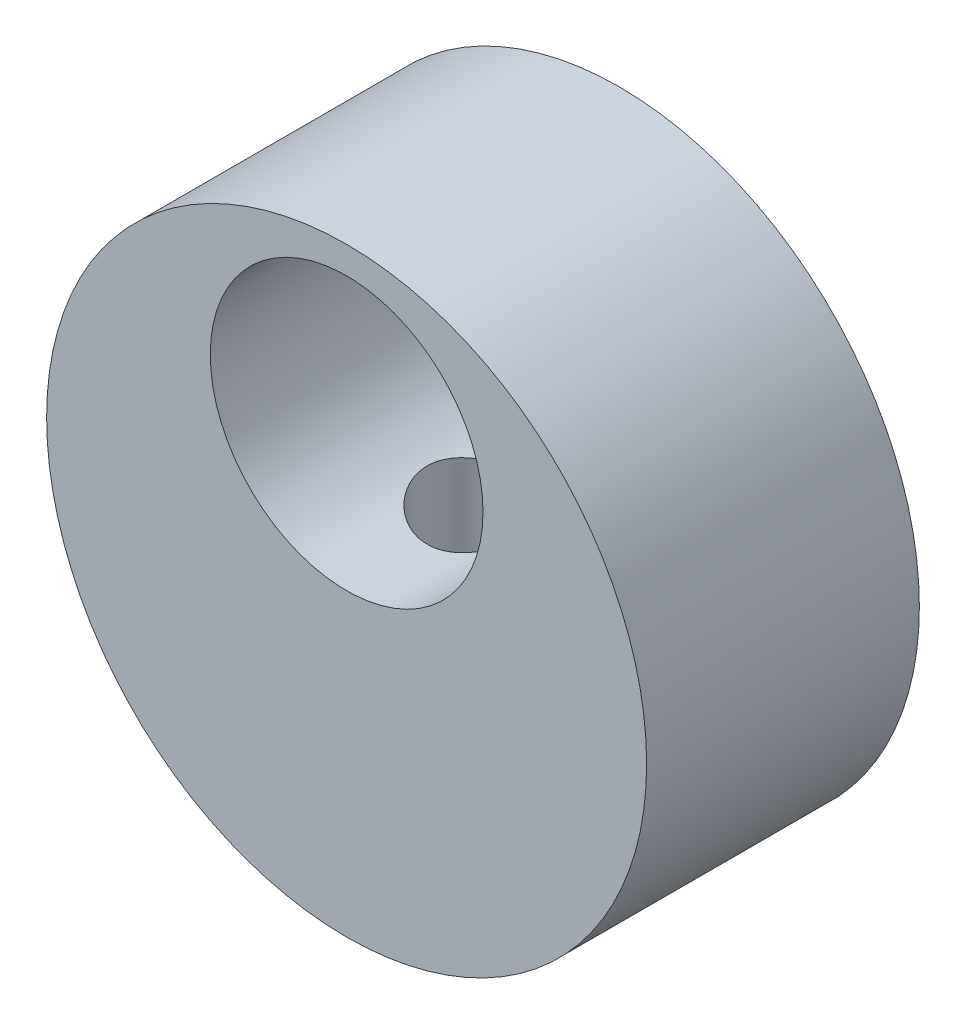
ISO-10303-21;
HEADER;
FILE_DESCRIPTION(('STEP AP214'),'2;1');
FILE_NAME('part.step','',(''),(''),'','','');
FILE_SCHEMA(('AUTOMOTIVE_DESIGN { 1 0 10303 214 1 1 1 1 }'));
ENDSEC;
DATA;
#1=APPLICATION_CONTEXT('core data for automotive mechanical design processes');
#2=APPLICATION_PROTOCOL_DEFINITION('international standard','automotive_design',2000,#1);
#3=PRODUCT_CONTEXT('',#1,'mechanical');
#4=PRODUCT('Part','Part','',(#3));
#5=PRODUCT_RELATED_PRODUCT_CATEGORY('part','',(#4));
#6=PRODUCT_DEFINITION_FORMATION('','',#4);
#7=PRODUCT_DEFINITION_CONTEXT('part definition',#1,'design');
#8=PRODUCT_DEFINITION('design','',#6,#7);
#9=PRODUCT_DEFINITION_SHAPE('','',#8);
#10=(LENGTH_UNIT() NAMED_UNIT(*) SI_UNIT(.MILLI.,.METRE.));
#11=(NAMED_UNIT(*) PLANE_ANGLE_UNIT() SI_UNIT($,.RADIAN.));
#12=(NAMED_UNIT(*) SI_UNIT($,.STERADIAN.) SOLID_ANGLE_UNIT());
#13=UNCERTAINTY_MEASURE_WITH_UNIT(LENGTH_MEASURE(1.E-05),#10,'distance_accuracy_value','');
#14=(GEOMETRIC_REPRESENTATION_CONTEXT(3) GLOBAL_UNCERTAINTY_ASSIGNED_CONTEXT((#13)) GLOBAL_UNIT_ASSIGNED_CONTEXT((#10,
#11,#12)) REPRESENTATION_CONTEXT('',''));
#15=CARTESIAN_POINT('',(0.,0.,0.));
#16=DIRECTION('',(0.,0.,1.));
#17=DIRECTION('',(1.,0.,0.));
#18=AXIS2_PLACEMENT_3D('',#15,#16,#17);
#19=CARTESIAN_POINT('',(0.,0.,5.));
#20=DIRECTION('',(0.,0.,-1.));
#21=DIRECTION('',(-1.,0.,0.));
#22=AXIS2_PLACEMENT_3D('',#19,#20,#21);
#23=CYLINDRICAL_SURFACE('',#22,5.5);
#24=CARTESIAN_POINT('',(0.,-5.5,1.47500000000001));
#25=CARTESIAN_POINT('',(-0.0570454154887206,-5.49999896917918,1.47500218651317));
#26=CARTESIAN_POINT('',(-0.114119352530093,-5.4991033284911,1.47977830587974));
#27=CARTESIAN_POINT('',(-0.226659349740724,-5.49561676296069,1.49874454029604));
#28=CARTESIAN_POINT('',(-0.282124004231445,-5.49302440001204,1.51294264136262));
#29=CARTESIAN_POINT('',(-0.38980155033272,-5.48643442315173,1.55030335954706));
#30=CARTESIAN_POINT('',(-0.442017314090575,-5.48243807181068,1.57345792423163));
#31=CARTESIAN_POINT('',(-0.54181793199329,-5.47347668726221,1.62805153966924));
#32=CARTESIAN_POINT('',(-0.589403169341833,-5.46851173431471,1.65948990408869));
#33=CARTESIAN_POINT('',(-0.679160163843666,-5.45809557817604,1.73015379118843));
#34=CARTESIAN_POINT('',(-0.721269178927114,-5.45263977785274,1.7694583391934));
#35=CARTESIAN_POINT('',(-0.79833567430584,-5.44189101023455,1.85456888125269));
#36=CARTESIAN_POINT('',(-0.83329264461948,-5.43659805457425,1.9003753385361));
#37=CARTESIAN_POINT('',(-0.895323167811041,-5.42672958887379,1.99763211789463));
#38=CARTESIAN_POINT('',(-0.922332998431911,-5.42216000688211,2.04912373654006));
#39=CARTESIAN_POINT('',(-0.967294632785072,-5.41432039127752,2.15601312085753));
#40=CARTESIAN_POINT('',(-0.985247207794641,-5.41105024701508,2.21141055346906));
#41=CARTESIAN_POINT('',(-1.0113835712208,-5.4062260050996,2.32386805251153));
#42=CARTESIAN_POINT('',(-1.01967671723467,-5.40465271223271,2.38090186331639));
#43=CARTESIAN_POINT('',(-1.02659822899771,-5.40334242353479,2.49557144109255));
#44=CARTESIAN_POINT('',(-1.02522745085078,-5.40360526504501,2.55320715429109));
#45=CARTESIAN_POINT('',(-1.01294872355646,-5.40592006826577,2.66665285649531));
#46=CARTESIAN_POINT('',(-1.00216504021043,-5.407948717441,2.72247684121865));
#47=CARTESIAN_POINT('',(-0.971562272403574,-5.4135299477407,2.83150916535301));
#48=CARTESIAN_POINT('',(-0.951742808207182,-5.41708259291189,2.88471739473079));
#49=CARTESIAN_POINT('',(-0.903509298071749,-5.42533593832795,2.98737189988671));
#50=CARTESIAN_POINT('',(-0.875044993688807,-5.43004332022502,3.03679400172326));
#51=CARTESIAN_POINT('',(-0.810365352558061,-5.4400713050207,3.13020726858463));
#52=CARTESIAN_POINT('',(-0.774149238363427,-5.4453919694021,3.1741978881753));
#53=CARTESIAN_POINT('',(-0.694323627738361,-5.45614864245733,3.25621750980742));
#54=CARTESIAN_POINT('',(-0.650607823669088,-5.46158515740218,3.29414305737617));
#55=CARTESIAN_POINT('',(-0.5573797090691,-5.47188483714764,3.36213775237498));
#56=CARTESIAN_POINT('',(-0.507867341752915,-5.4767479963305,3.39220682283049));
#57=CARTESIAN_POINT('',(-0.404344270130427,-5.48536265677905,3.44364991966489));
#58=CARTESIAN_POINT('',(-0.350328144488642,-5.4891127927721,3.4650132791962));
#59=CARTESIAN_POINT('',(-0.23938856741809,-5.49506829645425,3.49833442303847));
#60=CARTESIAN_POINT('',(-0.182465421710319,-5.49727382622665,3.51029319423629));
#61=CARTESIAN_POINT('',(-0.0682177929548256,-5.49986937718104,3.52432191306068));
#62=CARTESIAN_POINT('',(-0.0109112894183129,-5.50028542298561,3.52653362479276));
#63=CARTESIAN_POINT('',(0.103252728292034,-5.49932698194459,3.52138557739612));
#64=CARTESIAN_POINT('',(0.160110264113463,-5.49795258196472,3.51402628261688));
#65=CARTESIAN_POINT('',(0.271313389406505,-5.49358387929909,3.49006299084531));
#66=CARTESIAN_POINT('',(0.325674953816259,-5.49060213539889,3.47353063746772));
#67=CARTESIAN_POINT('',(0.430854730003924,-5.48335170259532,3.43176798416014));
#68=CARTESIAN_POINT('',(0.481672703200181,-5.47908292714195,3.40653709925699));
#69=CARTESIAN_POINT('',(0.578928393283424,-5.46966703133507,3.34777920314085));
#70=CARTESIAN_POINT('',(0.625312820408977,-5.46451091479078,3.31416545805275));
#71=CARTESIAN_POINT('',(0.711833474998586,-5.45391570200627,3.23971348986519));
#72=CARTESIAN_POINT('',(0.751969125923864,-5.44847657971644,3.19887460088485));
#73=CARTESIAN_POINT('',(0.825390848778108,-5.43784216608355,3.11049015251642));
#74=CARTESIAN_POINT('',(0.858580229152048,-5.43265100597145,3.06286369104304));
#75=CARTESIAN_POINT('',(0.916487728465371,-5.42318308214473,2.96262826205635));
#76=CARTESIAN_POINT('',(0.94120615986673,-5.41890628470485,2.91001947841385));
#77=CARTESIAN_POINT('',(0.981332577769456,-5.4117836648877,2.80155966996151));
#78=CARTESIAN_POINT('',(0.996785098941747,-5.40893100894043,2.74572559115179));
#79=CARTESIAN_POINT('',(1.01807856918004,-5.40496396040617,2.63219556340819));
#80=CARTESIAN_POINT('',(1.02392058805032,-5.40384937434463,2.57449982243652));
#81=CARTESIAN_POINT('',(1.02579176221352,-5.40349439262255,2.45985259632426));
#82=CARTESIAN_POINT('',(1.02197341899268,-5.40422486991697,2.40290363444543));
#83=CARTESIAN_POINT('',(1.00496589925145,-5.40741316544242,2.29047444827181));
#84=CARTESIAN_POINT('',(0.991776777112784,-5.40987097364916,2.23499421545544));
#85=CARTESIAN_POINT('',(0.956466102128654,-5.4162247997369,2.12715808143118));
#86=CARTESIAN_POINT('',(0.934360869990643,-5.42011818871279,2.07479667120579));
#87=CARTESIAN_POINT('',(0.88186207879566,-5.42890638513063,1.97450137739784));
#88=CARTESIAN_POINT('',(0.851467943978466,-5.43380126213162,1.92656780168938));
#89=CARTESIAN_POINT('',(0.782723131130003,-5.44413143169365,1.83572454752565));
#90=CARTESIAN_POINT('',(0.744261395985836,-5.44957364786601,1.79289968359965));
#91=CARTESIAN_POINT('',(0.660704909444109,-5.46033330310964,1.7142608472383));
#92=CARTESIAN_POINT('',(0.615608636154304,-5.46565071322635,1.67844848780193));
#93=CARTESIAN_POINT('',(0.519583709079676,-5.47561696843227,1.61455455564066));
#94=CARTESIAN_POINT('',(0.468606829012229,-5.48025945876047,1.586544440938));
#95=CARTESIAN_POINT('',(0.362600834022114,-5.48829075733383,1.53953084598572));
#96=CARTESIAN_POINT('',(0.307575595362312,-5.49168074657598,1.52051887650773));
#97=CARTESIAN_POINT('',(0.210321258625932,-5.49613114062673,1.49591686593636));
#98=CARTESIAN_POINT('',(0.168661931271576,-5.49757379480203,1.48808639770927));
#99=CARTESIAN_POINT('',(0.0846736299908797,-5.49950859524356,1.47762721797677));
#100=CARTESIAN_POINT('',(0.0423446727640335,-5.50000076517578,1.47499837695662));
#101=CARTESIAN_POINT('',(0.,-5.5,1.47500000000001));
#102=B_SPLINE_CURVE_WITH_KNOTS('',3,(#24,#25,#26,#27,#28,#29,#30,#31,#32,#33,#34,#35,#36,#37,
#38,#39,#40,#41,#42,#43,#44,#45,#46,#47,#48,#49,#50,#51,#52,#53,#54,#55,#56,#57,#58,#59,#60,#61,
#62,#63,#64,#65,#66,#67,#68,#69,#70,#71,#72,#73,#74,#75,#76,#77,#78,#79,#80,#81,#82,#83,#84,#85,
#86,#87,#88,#89,#90,#91,#92,#93,#94,#95,#96,#97,#98,#99,#100,#101),.UNSPECIFIED.,.T.,.F.,(4,2,2,
2,2,2,2,2,2,2,2,2,2,2,2,2,2,2,2,2,2,2,2,2,2,2,2,2,2,2,2,2,2,2,2,2,2,2,4),(0.,0.170981393619169,
0.342107895491716,0.513080899967027,0.684039743351977,0.856811083283956,1.02959473850888,
1.20372825485267,1.37784694022458,1.54997459727014,1.72208700613061,1.89196103822771,
2.06184221006843,2.23273056435959,2.40363606547403,2.57720181147516,2.75076925793854,
2.92454873656122,3.09830997689704,3.2695354613302,3.44075263885234,3.61065102191982,
3.78056083282285,3.95230739360864,4.12406979108703,4.29808389308044,4.47209157564622,
4.64525607960435,4.8184013062489,4.98883031902001,5.15925834274322,5.32937580798808,
5.49950509287083,5.67215127393731,5.84483712012374,6.01905610030524,6.19311038571131,
6.32003261737538,6.4469516887769),.UNSPECIFIED.);
#103=CARTESIAN_POINT('',(0.,-5.5,1.47500000000001));
#104=VERTEX_POINT('',#103);
#105=EDGE_CURVE('E48',#104,#104,#102,.T.);
#106=ORIENTED_EDGE('',*,*,#105,.T.);
#107=EDGE_LOOP('',(#106));
#108=FACE_BOUND('',#107,.T.);
#109=CARTESIAN_POINT('',(0.,0.,5.));
#110=DIRECTION('',(0.,0.,1.));
#111=DIRECTION('',(1.,0.,0.));
#112=AXIS2_PLACEMENT_3D('',#109,#110,#111);
#113=CIRCLE('',#112,5.5);
#114=CARTESIAN_POINT('',(5.5,0.,5.));
#115=VERTEX_POINT('',#114);
#116=EDGE_CURVE('E10',#115,#115,#113,.T.);
#117=ORIENTED_EDGE('',*,*,#116,.F.);
#118=EDGE_LOOP('',(#117));
#119=FACE_BOUND('',#118,.T.);
#120=CARTESIAN_POINT('',(0.,0.,0.));
#121=DIRECTION('',(0.,0.,1.));
#122=DIRECTION('',(1.,0.,0.));
#123=AXIS2_PLACEMENT_3D('',#120,#121,#122);
#124=CIRCLE('',#123,5.5);
#125=CARTESIAN_POINT('',(5.5,0.,0.));
#126=VERTEX_POINT('',#125);
#127=EDGE_CURVE('E36',#126,#126,#124,.T.);
#128=ORIENTED_EDGE('',*,*,#127,.T.);
#129=EDGE_LOOP('',(#128));
#130=FACE_BOUND('',#129,.T.);
#131=ADVANCED_FACE('F32',(#108,#119,#130),#23,.T.);
#132=CARTESIAN_POINT('',(0.,0.,5.));
#133=DIRECTION('',(0.,0.,1.));
#134=DIRECTION('',(1.,0.,0.));
#135=AXIS2_PLACEMENT_3D('',#132,#133,#134);
#136=PLANE('',#135);
#137=CARTESIAN_POINT('',(0.,2.5,5.));
#138=DIRECTION('',(0.,0.,-1.));
#139=DIRECTION('',(-1.,0.,0.));
#140=AXIS2_PLACEMENT_3D('',#137,#138,#139);
#141=CIRCLE('',#140,2.5);
#142=CARTESIAN_POINT('',(-2.5,2.5,5.));
#143=VERTEX_POINT('',#142);
#144=EDGE_CURVE('E43',#143,#143,#141,.T.);
#145=ORIENTED_EDGE('',*,*,#144,.T.);
#146=EDGE_LOOP('',(#145));
#147=FACE_BOUND('',#146,.T.);
#148=ORIENTED_EDGE('',*,*,#116,.T.);
#149=EDGE_LOOP('',(#148));
#150=FACE_BOUND('',#149,.T.);
#151=ADVANCED_FACE('F74',(#147,#150),#136,.T.);
#152=CARTESIAN_POINT('',(0.,0.,0.));
#153=DIRECTION('',(0.,0.,1.));
#154=DIRECTION('',(1.,0.,0.));
#155=AXIS2_PLACEMENT_3D('',#152,#153,#154);
#156=PLANE('',#155);
#157=CARTESIAN_POINT('',(0.,2.5,0.));
#158=DIRECTION('',(0.,0.,-1.));
#159=DIRECTION('',(-1.,0.,0.));
#160=AXIS2_PLACEMENT_3D('',#157,#158,#159);
#161=CIRCLE('',#160,2.5);
#162=CARTESIAN_POINT('',(-2.5,2.5,0.));
#163=VERTEX_POINT('',#162);
#164=EDGE_CURVE('E45',#163,#163,#161,.T.);
#165=ORIENTED_EDGE('',*,*,#164,.F.);
#166=EDGE_LOOP('',(#165));
#167=FACE_BOUND('',#166,.T.);
#168=ORIENTED_EDGE('',*,*,#127,.F.);
#169=EDGE_LOOP('',(#168));
#170=FACE_BOUND('',#169,.T.);
#171=ADVANCED_FACE('F72',(#167,#170),#156,.F.);
#172=CARTESIAN_POINT('',(0.,2.5,5.));
#173=DIRECTION('',(0.,0.,-1.));
#174=DIRECTION('',(-1.,0.,0.));
#175=AXIS2_PLACEMENT_3D('',#172,#173,#174);
#176=CYLINDRICAL_SURFACE('',#175,2.5);
#177=CARTESIAN_POINT('',(0.,0.,1.47500000000001));
#178=CARTESIAN_POINT('',(0.0549800444444975,4.18762619559764E-06,1.47500560580863));
#179=CARTESIAN_POINT('',(0.11005027893062,0.00183481358109119,1.47944993349053));
#180=CARTESIAN_POINT('',(0.218633370682642,0.00898016827591453,1.49707110046472));
#181=CARTESIAN_POINT('',(0.272141699321894,0.014304144919328,1.51027111960344));
#182=CARTESIAN_POINT('',(0.375853511417249,0.0278634413131926,1.54483755926286));
#183=CARTESIAN_POINT('',(0.426067390718782,0.0360890231837817,1.56617668391425));
#184=CARTESIAN_POINT('',(0.522155225855614,0.0546468907112851,1.61630471430323));
#185=CARTESIAN_POINT('',(0.568030567004649,0.0649785005569703,1.64509123101483));
#186=CARTESIAN_POINT('',(0.656455628845246,0.0872758797030349,1.71078610442397));
#187=CARTESIAN_POINT('',(0.69876504786217,0.0992940508546288,1.7479999769011));
#188=CARTESIAN_POINT('',(0.776747581004103,0.123377984121016,1.82884771778161));
#189=CARTESIAN_POINT('',(0.812417302579643,0.135443767365558,1.87248484786514));
#190=CARTESIAN_POINT('',(0.877772309512994,0.15889348910899,1.96744360190492));
#191=CARTESIAN_POINT('',(0.907094859289103,0.170218207364057,2.01903102342425));
#192=CARTESIAN_POINT('',(0.956539174792092,0.190076178809889,2.12693842019658));
#193=CARTESIAN_POINT('',(0.976665531232772,0.198610824190383,2.18325601750042));
#194=CARTESIAN_POINT('',(1.00616203240571,0.211357022510968,2.29626068417871));
#195=CARTESIAN_POINT('',(1.01599373426018,0.215753096147699,2.35280567957451));
#196=CARTESIAN_POINT('',(1.02606262364541,0.220256782508546,2.46690057356104));
#197=CARTESIAN_POINT('',(1.02630486541186,0.220366654324396,2.52444992679061));
#198=CARTESIAN_POINT('',(1.01753646068384,0.21644219187569,2.63438934592787));
#199=CARTESIAN_POINT('',(1.00920714728225,0.212713007242955,2.6868468043491));
#200=CARTESIAN_POINT('',(0.98467216648814,0.202044873842882,2.78954093955016));
#201=CARTESIAN_POINT('',(0.968465046096561,0.195105332962179,2.83977720478302));
#202=CARTESIAN_POINT('',(0.92832121595358,0.178643274088669,2.93784940384662));
#203=CARTESIAN_POINT('',(0.904229723385062,0.169069701100272,2.98561302666123));
#204=CARTESIAN_POINT('',(0.849110123805354,0.148431032585183,3.0766013500277));
#205=CARTESIAN_POINT('',(0.818079331882854,0.137365360404316,3.11982428418446));
#206=CARTESIAN_POINT('',(0.746988607266621,0.113890540525057,3.20421532909054));
#207=CARTESIAN_POINT('',(0.706398592689369,0.101445437852854,3.24492813741867));
#208=CARTESIAN_POINT('',(0.618839888552581,0.0773780493812747,3.31911884654244));
#209=CARTESIAN_POINT('',(0.571869801178585,0.0657559447443572,3.35259515771234));
#210=CARTESIAN_POINT('',(0.471538024813138,0.0443257379406447,3.41200156034384));
#211=CARTESIAN_POINT('',(0.418059735488726,0.0345624831844872,3.4377520931628));
#212=CARTESIAN_POINT('',(0.307028057462266,0.0182921074435144,3.47973263882661));
#213=CARTESIAN_POINT('',(0.249476865777375,0.0117832460182031,3.49596774129895));
#214=CARTESIAN_POINT('',(0.1357426599769,0.00307694958860508,3.51751663907174));
#215=CARTESIAN_POINT('',(0.0796938872962663,0.000638543310875978,3.52344179959741));
#216=CARTESIAN_POINT('',(-0.0326451931346079,-0.000417180619272594,3.52601823210574));
#217=CARTESIAN_POINT('',(-0.0889354300361751,0.000964448479337212,3.52267206035247));
#218=CARTESIAN_POINT('',(-0.197333904126424,0.00723663419010519,3.50724339879739));
#219=CARTESIAN_POINT('',(-0.249513529971212,0.0119566219958739,3.49558536764279));
#220=CARTESIAN_POINT('',(-0.351122844404042,0.0242508816823177,3.464449312178));
#221=CARTESIAN_POINT('',(-0.400552182099634,0.0318255168160616,3.44497029262861));
#222=CARTESIAN_POINT('',(-0.496979897981094,0.0493902326401266,3.39810834975241));
#223=CARTESIAN_POINT('',(-0.543855927115149,0.0594477313149051,3.3704997496465));
#224=CARTESIAN_POINT('',(-0.632476480352741,0.0808977470178823,3.30841122750238));
#225=CARTESIAN_POINT('',(-0.674218882500908,0.0922908123198346,3.27392847940651));
#226=CARTESIAN_POINT('',(-0.754424612171529,0.116155607134227,3.19627274467646));
#227=CARTESIAN_POINT('',(-0.792460404720459,0.128647382506596,3.15266320195156));
#228=CARTESIAN_POINT('',(-0.860787474255821,0.152584615851097,3.05947187748414));
#229=CARTESIAN_POINT('',(-0.891077195174073,0.164029863295454,3.00988889870731));
#230=CARTESIAN_POINT('',(-0.943322359299337,0.184628557509507,2.90524974169866));
#231=CARTESIAN_POINT('',(-0.965170393323442,0.193751994286315,2.8501335970136));
#232=CARTESIAN_POINT('',(-0.999096299392198,0.208242313087363,2.73651482355323));
#233=CARTESIAN_POINT('',(-1.01118188326337,0.213612159799583,2.67801490700799));
#234=CARTESIAN_POINT('',(-1.0244852062053,0.219544295906427,2.56401659753685));
#235=CARTESIAN_POINT('',(-1.02644999062509,0.22043691948574,2.50862211309595));
#236=CARTESIAN_POINT('',(-1.02143716668989,0.218186293746032,2.39832848464364));
#237=CARTESIAN_POINT('',(-1.01446083003864,0.215043618371113,2.3434292713077));
#238=CARTESIAN_POINT('',(-0.992384470161542,0.20537423494408,2.23814819152632));
#239=CARTESIAN_POINT('',(-0.977652336794389,0.199001227212524,2.18767374355668));
#240=CARTESIAN_POINT('',(-0.940835897861426,0.183704879922162,2.0898977862963));
#241=CARTESIAN_POINT('',(-0.918749540218856,0.174780828634563,2.04259716704204));
#242=CARTESIAN_POINT('',(-0.866348419496287,0.154734445791991,1.94946697035947));
#243=CARTESIAN_POINT('',(-0.835624965615061,0.143513460466166,1.90388896017039));
#244=CARTESIAN_POINT('',(-0.767404141503378,0.120423017899786,1.81830131887125));
#245=CARTESIAN_POINT('',(-0.729904544279259,0.108553348365104,1.77829352610111));
#246=CARTESIAN_POINT('',(-0.646095566523611,0.0845108410049463,1.70212166001761));
#247=CARTESIAN_POINT('',(-0.599354812499867,0.0723743511564611,1.66641856419483));
#248=CARTESIAN_POINT('',(-0.500090990354927,0.0500013374125549,1.6033447685611));
#249=CARTESIAN_POINT('',(-0.447565285273023,0.0397656857363573,1.5759778902401));
#250=CARTESIAN_POINT('',(-0.339102108898575,0.022506567566082,1.53096759102551));
#251=CARTESIAN_POINT('',(-0.283240186948489,0.0154301544375444,1.51316279596034));
#252=CARTESIAN_POINT('',(-0.169067758169517,0.00507010536530105,1.48735786422381));
#253=CARTESIAN_POINT('',(-0.110765565323517,0.00177452997493211,1.47932685814899));
#254=CARTESIAN_POINT('',(-0.0348614262507946,0.000181019489341659,1.47544282385274));
#255=CARTESIAN_POINT('',(-0.0174352480981474,-1.32797822134987E-06,1.47499822228838));
#256=CARTESIAN_POINT('',(0.,0.,1.47500000000001));
#257=B_SPLINE_CURVE_WITH_KNOTS('',3,(#177,#178,#179,#180,#181,#182,#183,#184,#185,#186,#187,
#188,#189,#190,#191,#192,#193,#194,#195,#196,#197,#198,#199,#200,#201,#202,#203,#204,#205,#206,
#207,#208,#209,#210,#211,#212,#213,#214,#215,#216,#217,#218,#219,#220,#221,#222,#223,#224,#225,
#226,#227,#228,#229,#230,#231,#232,#233,#234,#235,#236,#237,#238,#239,#240,#241,#242,#243,#244,
#245,#246,#247,#248,#249,#250,#251,#252,#253,#254,#255,#256),.UNSPECIFIED.,.T.,.F.,(4,2,2,2,2,2,
2,2,2,2,2,2,2,2,2,2,2,2,2,2,2,2,2,2,2,2,2,2,2,2,2,2,2,2,2,2,2,2,2,4),(0.,0.164891713446024,
0.330221713413177,0.495002058225208,0.659729609058723,0.831820112774437,1.00399830610918,
1.18431810375537,1.36454778765855,1.53629703191308,1.70795575253876,1.86694998373282,
2.02597355128654,2.18832778894296,2.35074495272941,2.52641226014076,2.70211811688608,
2.88163761104127,3.06106099570587,3.22942751977944,3.39774762695745,3.558036583134,
3.71834594292583,3.88360993661217,4.04894201325818,4.22572845867614,4.40255038995914,
4.58155336561516,4.76041479959206,4.9258628428138,5.09128735682187,5.24949111412153,
5.40773905265304,5.57532636382493,5.74296885342414,5.92227303411654,6.10165928818158,
6.27791457447611,6.45361172155718,6.50590211095769),.UNSPECIFIED.);
#258=CARTESIAN_POINT('',(0.,0.,1.47500000000001));
#259=VERTEX_POINT('',#258);
#260=EDGE_CURVE('E57',#259,#259,#257,.T.);
#261=ORIENTED_EDGE('',*,*,#260,.T.);
#262=EDGE_LOOP('',(#261));
#263=FACE_BOUND('',#262,.T.);
#264=ORIENTED_EDGE('',*,*,#144,.F.);
#265=EDGE_LOOP('',(#264));
#266=FACE_BOUND('',#265,.T.);
#267=ORIENTED_EDGE('',*,*,#164,.T.);
#268=EDGE_LOOP('',(#267));
#269=FACE_BOUND('',#268,.T.);
#270=ADVANCED_FACE('F65',(#263,#266,#269),#176,.F.);
#271=CARTESIAN_POINT('',(0.,-5.5,2.5));
#272=DIRECTION('',(0.,-1.,0.));
#273=DIRECTION('',(0.,0.,-1.));
#274=AXIS2_PLACEMENT_3D('',#271,#272,#273);
#275=CYLINDRICAL_SURFACE('',#274,1.02499999999999);
#276=ORIENTED_EDGE('',*,*,#260,.F.);
#277=EDGE_LOOP('',(#276));
#278=FACE_BOUND('',#277,.T.);
#279=ORIENTED_EDGE('',*,*,#105,.F.);
#280=EDGE_LOOP('',(#279));
#281=FACE_BOUND('',#280,.T.);
#282=ADVANCED_FACE('F62',(#278,#281),#275,.F.);
#283=CLOSED_SHELL('',(#131,#151,#171,#270,#282));
#284=MANIFOLD_SOLID_BREP('B2',#283);
#285=ADVANCED_BREP_SHAPE_REPRESENTATION('',(#18,#284),#14);
#286=SHAPE_DEFINITION_REPRESENTATION(#9,#285);
ENDSEC;
END-ISO-10303-21;
